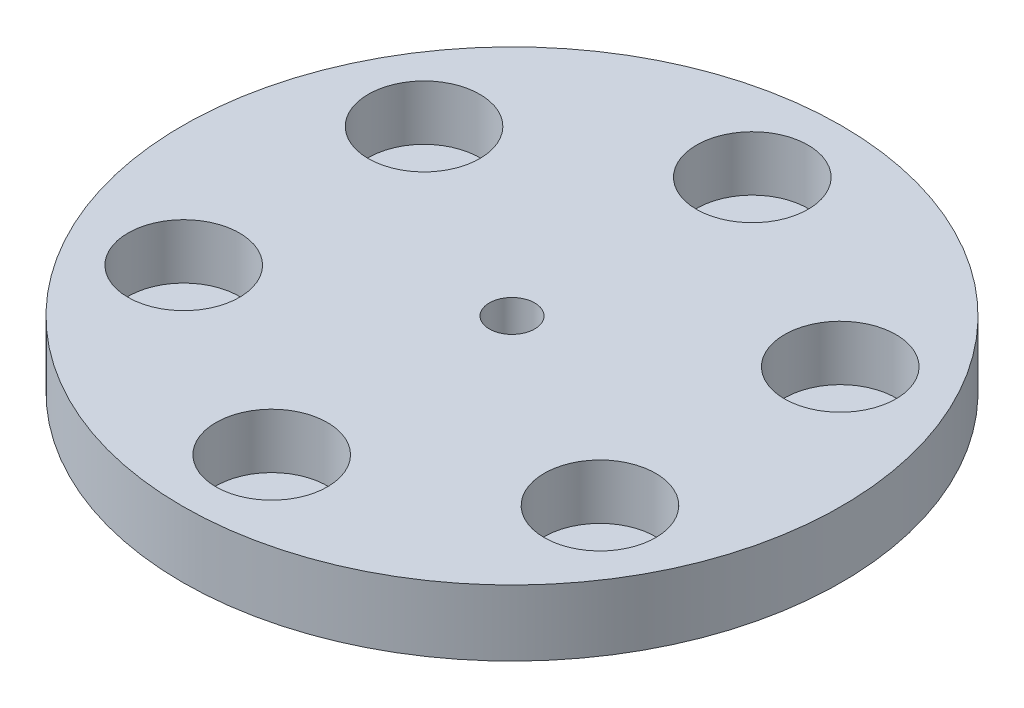
ISO-10303-21;
HEADER;
FILE_DESCRIPTION(('STEP AP214'),'2;1');
FILE_NAME('part.step','',(''),(''),'','','');
FILE_SCHEMA(('AUTOMOTIVE_DESIGN { 1 0 10303 214 1 1 1 1 }'));
ENDSEC;
DATA;
#1=APPLICATION_CONTEXT('core data for automotive mechanical design processes');
#2=APPLICATION_PROTOCOL_DEFINITION('international standard','automotive_design',2000,#1);
#3=PRODUCT_CONTEXT('',#1,'mechanical');
#4=PRODUCT('Part','Part','',(#3));
#5=PRODUCT_RELATED_PRODUCT_CATEGORY('part','',(#4));
#6=PRODUCT_DEFINITION_FORMATION('','',#4);
#7=PRODUCT_DEFINITION_CONTEXT('part definition',#1,'design');
#8=PRODUCT_DEFINITION('design','',#6,#7);
#9=PRODUCT_DEFINITION_SHAPE('','',#8);
#10=(LENGTH_UNIT() NAMED_UNIT(*) SI_UNIT(.MILLI.,.METRE.));
#11=(NAMED_UNIT(*) PLANE_ANGLE_UNIT() SI_UNIT($,.RADIAN.));
#12=(NAMED_UNIT(*) SI_UNIT($,.STERADIAN.) SOLID_ANGLE_UNIT());
#13=UNCERTAINTY_MEASURE_WITH_UNIT(LENGTH_MEASURE(1.E-05),#10,'distance_accuracy_value','');
#14=(GEOMETRIC_REPRESENTATION_CONTEXT(3) GLOBAL_UNCERTAINTY_ASSIGNED_CONTEXT((#13)) GLOBAL_UNIT_ASSIGNED_CONTEXT((#10,
#11,#12)) REPRESENTATION_CONTEXT('',''));
#15=CARTESIAN_POINT('',(0.,0.,0.));
#16=DIRECTION('',(0.,0.,1.));
#17=DIRECTION('',(1.,0.,0.));
#18=AXIS2_PLACEMENT_3D('',#15,#16,#17);
#19=CARTESIAN_POINT('',(0.,12.,0.));
#20=DIRECTION('',(0.,1.,0.));
#21=DIRECTION('',(0.,0.,1.));
#22=AXIS2_PLACEMENT_3D('',#19,#20,#21);
#23=PLANE('',#22);
#24=CARTESIAN_POINT('',(37.8886114155705,12.,-21.8750000000022));
#25=DIRECTION('',(0.,1.,0.));
#26=DIRECTION('',(0.,0.,1.));
#27=AXIS2_PLACEMENT_3D('',#24,#25,#26);
#28=CIRCLE('',#27,10.15);
#29=CARTESIAN_POINT('',(37.8886114155705,12.,-11.7250000000022));
#30=VERTEX_POINT('',#29);
#31=EDGE_CURVE('E81',#30,#30,#28,.T.);
#32=ORIENTED_EDGE('',*,*,#31,.F.);
#33=EDGE_LOOP('',(#32));
#34=FACE_BOUND('',#33,.T.);
#35=CARTESIAN_POINT('',(37.888611415573,12.,21.8749999999978));
#36=DIRECTION('',(0.,1.,0.));
#37=DIRECTION('',(0.,0.,1.));
#38=AXIS2_PLACEMENT_3D('',#35,#36,#37);
#39=CIRCLE('',#38,10.15);
#40=CARTESIAN_POINT('',(37.888611415573,12.,32.0249999999978));
#41=VERTEX_POINT('',#40);
#42=EDGE_CURVE('E75',#41,#41,#39,.T.);
#43=ORIENTED_EDGE('',*,*,#42,.F.);
#44=EDGE_LOOP('',(#43));
#45=FACE_BOUND('',#44,.T.);
#46=CARTESIAN_POINT('',(5.07640293451003E-12,12.,43.75));
#47=DIRECTION('',(0.,1.,0.));
#48=DIRECTION('',(0.,0.,1.));
#49=AXIS2_PLACEMENT_3D('',#46,#47,#48);
#50=CIRCLE('',#49,10.15);
#51=CARTESIAN_POINT('',(5.07640293451003E-12,12.,53.9));
#52=VERTEX_POINT('',#51);
#53=EDGE_CURVE('E69',#52,#52,#50,.T.);
#54=ORIENTED_EDGE('',*,*,#53,.F.);
#55=EDGE_LOOP('',(#54));
#56=FACE_BOUND('',#55,.T.);
#57=CARTESIAN_POINT('',(-37.8886114155654,12.,21.8750000000022));
#58=DIRECTION('',(0.,1.,0.));
#59=DIRECTION('',(0.,0.,1.));
#60=AXIS2_PLACEMENT_3D('',#57,#58,#59);
#61=CIRCLE('',#60,10.15);
#62=CARTESIAN_POINT('',(-37.8886114155654,12.,32.0250000000022));
#63=VERTEX_POINT('',#62);
#64=EDGE_CURVE('E63',#63,#63,#61,.T.);
#65=ORIENTED_EDGE('',*,*,#64,.F.);
#66=EDGE_LOOP('',(#65));
#67=FACE_BOUND('',#66,.T.);
#68=CARTESIAN_POINT('',(-37.8886114155679,12.,-21.8749999999978));
#69=DIRECTION('',(0.,1.,0.));
#70=DIRECTION('',(0.,0.,1.));
#71=AXIS2_PLACEMENT_3D('',#68,#69,#70);
#72=CIRCLE('',#71,10.15);
#73=CARTESIAN_POINT('',(-37.8886114155679,12.,-11.7249999999978));
#74=VERTEX_POINT('',#73);
#75=EDGE_CURVE('E57',#74,#74,#72,.T.);
#76=ORIENTED_EDGE('',*,*,#75,.F.);
#77=EDGE_LOOP('',(#76));
#78=FACE_BOUND('',#77,.T.);
#79=CARTESIAN_POINT('',(0.,12.,-43.75));
#80=DIRECTION('',(0.,1.,0.));
#81=DIRECTION('',(0.,0.,1.));
#82=AXIS2_PLACEMENT_3D('',#79,#80,#81);
#83=CIRCLE('',#82,10.15);
#84=CARTESIAN_POINT('',(0.,12.,-33.6));
#85=VERTEX_POINT('',#84);
#86=EDGE_CURVE('E51',#85,#85,#83,.T.);
#87=ORIENTED_EDGE('',*,*,#86,.F.);
#88=EDGE_LOOP('',(#87));
#89=FACE_BOUND('',#88,.T.);
#90=CARTESIAN_POINT('',(0.,12.,0.));
#91=DIRECTION('',(0.,1.,0.));
#92=DIRECTION('',(0.,0.,1.));
#93=AXIS2_PLACEMENT_3D('',#90,#91,#92);
#94=CIRCLE('',#93,60.);
#95=CARTESIAN_POINT('',(0.,12.,60.));
#96=VERTEX_POINT('',#95);
#97=EDGE_CURVE('E10',#96,#96,#94,.T.);
#98=ORIENTED_EDGE('',*,*,#97,.T.);
#99=EDGE_LOOP('',(#98));
#100=FACE_BOUND('',#99,.T.);
#101=CARTESIAN_POINT('',(0.,12.,0.));
#102=DIRECTION('',(0.,1.,0.));
#103=DIRECTION('',(0.,0.,1.));
#104=AXIS2_PLACEMENT_3D('',#101,#102,#103);
#105=CIRCLE('',#104,4.125);
#106=CARTESIAN_POINT('',(0.,12.,4.125));
#107=VERTEX_POINT('',#106);
#108=EDGE_CURVE('E43',#107,#107,#105,.T.);
#109=ORIENTED_EDGE('',*,*,#108,.F.);
#110=EDGE_LOOP('',(#109));
#111=FACE_BOUND('',#110,.T.);
#112=ADVANCED_FACE('F32',(#34,#45,#56,#67,#78,#89,#100,#111),#23,.T.);
#113=CARTESIAN_POINT('',(0.,0.,0.));
#114=DIRECTION('',(0.,1.,0.));
#115=DIRECTION('',(0.,0.,1.));
#116=AXIS2_PLACEMENT_3D('',#113,#114,#115);
#117=PLANE('',#116);
#118=CARTESIAN_POINT('',(0.,0.,0.));
#119=DIRECTION('',(0.,1.,0.));
#120=DIRECTION('',(0.,0.,1.));
#121=AXIS2_PLACEMENT_3D('',#118,#119,#120);
#122=CIRCLE('',#121,60.);
#123=CARTESIAN_POINT('',(0.,0.,60.));
#124=VERTEX_POINT('',#123);
#125=EDGE_CURVE('E36',#124,#124,#122,.T.);
#126=ORIENTED_EDGE('',*,*,#125,.F.);
#127=EDGE_LOOP('',(#126));
#128=FACE_BOUND('',#127,.T.);
#129=CARTESIAN_POINT('',(0.,0.,0.));
#130=DIRECTION('',(0.,1.,0.));
#131=DIRECTION('',(0.,0.,1.));
#132=AXIS2_PLACEMENT_3D('',#129,#130,#131);
#133=CIRCLE('',#132,4.125);
#134=CARTESIAN_POINT('',(0.,0.,4.125));
#135=VERTEX_POINT('',#134);
#136=EDGE_CURVE('E45',#135,#135,#133,.T.);
#137=ORIENTED_EDGE('',*,*,#136,.T.);
#138=EDGE_LOOP('',(#137));
#139=FACE_BOUND('',#138,.T.);
#140=ADVANCED_FACE('F98',(#128,#139),#117,.F.);
#141=CARTESIAN_POINT('',(0.,12.,0.));
#142=DIRECTION('',(0.,-1.,0.));
#143=DIRECTION('',(0.,0.,-1.));
#144=AXIS2_PLACEMENT_3D('',#141,#142,#143);
#145=CYLINDRICAL_SURFACE('',#144,60.);
#146=ORIENTED_EDGE('',*,*,#97,.F.);
#147=EDGE_LOOP('',(#146));
#148=FACE_BOUND('',#147,.T.);
#149=ORIENTED_EDGE('',*,*,#125,.T.);
#150=EDGE_LOOP('',(#149));
#151=FACE_BOUND('',#150,.T.);
#152=ADVANCED_FACE('F34',(#148,#151),#145,.T.);
#153=CARTESIAN_POINT('',(0.,12.,0.));
#154=DIRECTION('',(0.,-1.,0.));
#155=DIRECTION('',(0.,0.,-1.));
#156=AXIS2_PLACEMENT_3D('',#153,#154,#155);
#157=CYLINDRICAL_SURFACE('',#156,4.125);
#158=ORIENTED_EDGE('',*,*,#108,.T.);
#159=EDGE_LOOP('',(#158));
#160=FACE_BOUND('',#159,.T.);
#161=ORIENTED_EDGE('',*,*,#136,.F.);
#162=EDGE_LOOP('',(#161));
#163=FACE_BOUND('',#162,.T.);
#164=ADVANCED_FACE('F112',(#160,#163),#157,.F.);
#165=CARTESIAN_POINT('',(0.,2.,-43.75));
#166=DIRECTION('',(0.,1.,0.));
#167=DIRECTION('',(0.,0.,1.));
#168=AXIS2_PLACEMENT_3D('',#165,#166,#167);
#169=CYLINDRICAL_SURFACE('',#168,10.15);
#170=CARTESIAN_POINT('',(0.,2.,-43.75));
#171=DIRECTION('',(0.,1.,0.));
#172=DIRECTION('',(0.,0.,1.));
#173=AXIS2_PLACEMENT_3D('',#170,#171,#172);
#174=CIRCLE('',#173,10.15);
#175=CARTESIAN_POINT('',(0.,2.,-33.6));
#176=VERTEX_POINT('',#175);
#177=EDGE_CURVE('E48',#176,#176,#174,.T.);
#178=ORIENTED_EDGE('',*,*,#177,.F.);
#179=EDGE_LOOP('',(#178));
#180=FACE_BOUND('',#179,.T.);
#181=ORIENTED_EDGE('',*,*,#86,.T.);
#182=EDGE_LOOP('',(#181));
#183=FACE_BOUND('',#182,.T.);
#184=ADVANCED_FACE('F115',(#180,#183),#169,.F.);
#185=CARTESIAN_POINT('',(0.,2.,-43.75));
#186=DIRECTION('',(0.,1.,0.));
#187=DIRECTION('',(0.,0.,1.));
#188=AXIS2_PLACEMENT_3D('',#185,#186,#187);
#189=PLANE('',#188);
#190=ORIENTED_EDGE('',*,*,#177,.T.);
#191=EDGE_LOOP('',(#190));
#192=FACE_BOUND('',#191,.T.);
#193=ADVANCED_FACE('F129',(#192),#189,.T.);
#194=CARTESIAN_POINT('',(-37.8886114155679,2.,-21.8749999999978));
#195=DIRECTION('',(0.,1.,0.));
#196=DIRECTION('',(0.,0.,1.));
#197=AXIS2_PLACEMENT_3D('',#194,#195,#196);
#198=CYLINDRICAL_SURFACE('',#197,10.15);
#199=CARTESIAN_POINT('',(-37.8886114155679,2.,-21.8749999999978));
#200=DIRECTION('',(0.,1.,0.));
#201=DIRECTION('',(0.,0.,1.));
#202=AXIS2_PLACEMENT_3D('',#199,#200,#201);
#203=CIRCLE('',#202,10.15);
#204=CARTESIAN_POINT('',(-37.8886114155679,2.,-11.7249999999978));
#205=VERTEX_POINT('',#204);
#206=EDGE_CURVE('E60',#205,#205,#203,.T.);
#207=ORIENTED_EDGE('',*,*,#206,.F.);
#208=EDGE_LOOP('',(#207));
#209=FACE_BOUND('',#208,.T.);
#210=ORIENTED_EDGE('',*,*,#75,.T.);
#211=EDGE_LOOP('',(#210));
#212=FACE_BOUND('',#211,.T.);
#213=ADVANCED_FACE('F133',(#209,#212),#198,.F.);
#214=CARTESIAN_POINT('',(-37.8886114155679,2.,-21.8749999999978));
#215=DIRECTION('',(0.,1.,0.));
#216=DIRECTION('',(0.,0.,1.));
#217=AXIS2_PLACEMENT_3D('',#214,#215,#216);
#218=PLANE('',#217);
#219=ORIENTED_EDGE('',*,*,#206,.T.);
#220=EDGE_LOOP('',(#219));
#221=FACE_BOUND('',#220,.T.);
#222=ADVANCED_FACE('F137',(#221),#218,.T.);
#223=CARTESIAN_POINT('',(-37.8886114155654,2.,21.8750000000022));
#224=DIRECTION('',(0.,1.,0.));
#225=DIRECTION('',(0.,0.,1.));
#226=AXIS2_PLACEMENT_3D('',#223,#224,#225);
#227=CYLINDRICAL_SURFACE('',#226,10.15);
#228=CARTESIAN_POINT('',(-37.8886114155654,2.,21.8750000000022));
#229=DIRECTION('',(0.,1.,0.));
#230=DIRECTION('',(0.,0.,1.));
#231=AXIS2_PLACEMENT_3D('',#228,#229,#230);
#232=CIRCLE('',#231,10.15);
#233=CARTESIAN_POINT('',(-37.8886114155654,2.,32.0250000000022));
#234=VERTEX_POINT('',#233);
#235=EDGE_CURVE('E66',#234,#234,#232,.T.);
#236=ORIENTED_EDGE('',*,*,#235,.F.);
#237=EDGE_LOOP('',(#236));
#238=FACE_BOUND('',#237,.T.);
#239=ORIENTED_EDGE('',*,*,#64,.T.);
#240=EDGE_LOOP('',(#239));
#241=FACE_BOUND('',#240,.T.);
#242=ADVANCED_FACE('F141',(#238,#241),#227,.F.);
#243=CARTESIAN_POINT('',(-37.8886114155654,2.,21.8750000000022));
#244=DIRECTION('',(0.,1.,0.));
#245=DIRECTION('',(0.,0.,1.));
#246=AXIS2_PLACEMENT_3D('',#243,#244,#245);
#247=PLANE('',#246);
#248=ORIENTED_EDGE('',*,*,#235,.T.);
#249=EDGE_LOOP('',(#248));
#250=FACE_BOUND('',#249,.T.);
#251=ADVANCED_FACE('F145',(#250),#247,.T.);
#252=CARTESIAN_POINT('',(5.07640293451003E-12,2.,43.75));
#253=DIRECTION('',(0.,1.,0.));
#254=DIRECTION('',(0.,0.,1.));
#255=AXIS2_PLACEMENT_3D('',#252,#253,#254);
#256=CYLINDRICAL_SURFACE('',#255,10.15);
#257=CARTESIAN_POINT('',(5.07640293451003E-12,2.,43.75));
#258=DIRECTION('',(0.,1.,0.));
#259=DIRECTION('',(0.,0.,1.));
#260=AXIS2_PLACEMENT_3D('',#257,#258,#259);
#261=CIRCLE('',#260,10.15);
#262=CARTESIAN_POINT('',(5.07640293451003E-12,2.,53.9));
#263=VERTEX_POINT('',#262);
#264=EDGE_CURVE('E72',#263,#263,#261,.T.);
#265=ORIENTED_EDGE('',*,*,#264,.F.);
#266=EDGE_LOOP('',(#265));
#267=FACE_BOUND('',#266,.T.);
#268=ORIENTED_EDGE('',*,*,#53,.T.);
#269=EDGE_LOOP('',(#268));
#270=FACE_BOUND('',#269,.T.);
#271=ADVANCED_FACE('F149',(#267,#270),#256,.F.);
#272=CARTESIAN_POINT('',(5.07640293451003E-12,2.,43.75));
#273=DIRECTION('',(0.,1.,0.));
#274=DIRECTION('',(0.,0.,1.));
#275=AXIS2_PLACEMENT_3D('',#272,#273,#274);
#276=PLANE('',#275);
#277=ORIENTED_EDGE('',*,*,#264,.T.);
#278=EDGE_LOOP('',(#277));
#279=FACE_BOUND('',#278,.T.);
#280=ADVANCED_FACE('F153',(#279),#276,.T.);
#281=CARTESIAN_POINT('',(37.888611415573,2.,21.8749999999978));
#282=DIRECTION('',(0.,1.,0.));
#283=DIRECTION('',(0.,0.,1.));
#284=AXIS2_PLACEMENT_3D('',#281,#282,#283);
#285=CYLINDRICAL_SURFACE('',#284,10.15);
#286=CARTESIAN_POINT('',(37.888611415573,2.,21.8749999999978));
#287=DIRECTION('',(0.,1.,0.));
#288=DIRECTION('',(0.,0.,1.));
#289=AXIS2_PLACEMENT_3D('',#286,#287,#288);
#290=CIRCLE('',#289,10.15);
#291=CARTESIAN_POINT('',(37.888611415573,2.,32.0249999999978));
#292=VERTEX_POINT('',#291);
#293=EDGE_CURVE('E78',#292,#292,#290,.T.);
#294=ORIENTED_EDGE('',*,*,#293,.F.);
#295=EDGE_LOOP('',(#294));
#296=FACE_BOUND('',#295,.T.);
#297=ORIENTED_EDGE('',*,*,#42,.T.);
#298=EDGE_LOOP('',(#297));
#299=FACE_BOUND('',#298,.T.);
#300=ADVANCED_FACE('F157',(#296,#299),#285,.F.);
#301=CARTESIAN_POINT('',(37.888611415573,2.,21.8749999999978));
#302=DIRECTION('',(0.,1.,0.));
#303=DIRECTION('',(0.,0.,1.));
#304=AXIS2_PLACEMENT_3D('',#301,#302,#303);
#305=PLANE('',#304);
#306=ORIENTED_EDGE('',*,*,#293,.T.);
#307=EDGE_LOOP('',(#306));
#308=FACE_BOUND('',#307,.T.);
#309=ADVANCED_FACE('F92',(#308),#305,.T.);
#310=CARTESIAN_POINT('',(37.8886114155705,2.,-21.8750000000022));
#311=DIRECTION('',(0.,1.,0.));
#312=DIRECTION('',(0.,0.,1.));
#313=AXIS2_PLACEMENT_3D('',#310,#311,#312);
#314=CYLINDRICAL_SURFACE('',#313,10.15);
#315=CARTESIAN_POINT('',(37.8886114155705,2.,-21.8750000000022));
#316=DIRECTION('',(0.,1.,0.));
#317=DIRECTION('',(0.,0.,1.));
#318=AXIS2_PLACEMENT_3D('',#315,#316,#317);
#319=CIRCLE('',#318,10.15);
#320=CARTESIAN_POINT('',(37.8886114155705,2.,-11.7250000000022));
#321=VERTEX_POINT('',#320);
#322=EDGE_CURVE('E54',#321,#321,#319,.T.);
#323=ORIENTED_EDGE('',*,*,#322,.F.);
#324=EDGE_LOOP('',(#323));
#325=FACE_BOUND('',#324,.T.);
#326=ORIENTED_EDGE('',*,*,#31,.T.);
#327=EDGE_LOOP('',(#326));
#328=FACE_BOUND('',#327,.T.);
#329=ADVANCED_FACE('F89',(#325,#328),#314,.F.);
#330=CARTESIAN_POINT('',(37.8886114155705,2.,-21.8750000000022));
#331=DIRECTION('',(0.,1.,0.));
#332=DIRECTION('',(0.,0.,1.));
#333=AXIS2_PLACEMENT_3D('',#330,#331,#332);
#334=PLANE('',#333);
#335=ORIENTED_EDGE('',*,*,#322,.T.);
#336=EDGE_LOOP('',(#335));
#337=FACE_BOUND('',#336,.T.);
#338=ADVANCED_FACE('F87',(#337),#334,.T.);
#339=CLOSED_SHELL('',(#112,#140,#152,#164,#184,#193,#213,#222,#242,#251,#271,#280,#300,#309,
#329,#338));
#340=MANIFOLD_SOLID_BREP('B2',#339);
#341=ADVANCED_BREP_SHAPE_REPRESENTATION('',(#18,#340),#14);
#342=SHAPE_DEFINITION_REPRESENTATION(#9,#341);
ENDSEC;
END-ISO-10303-21;
